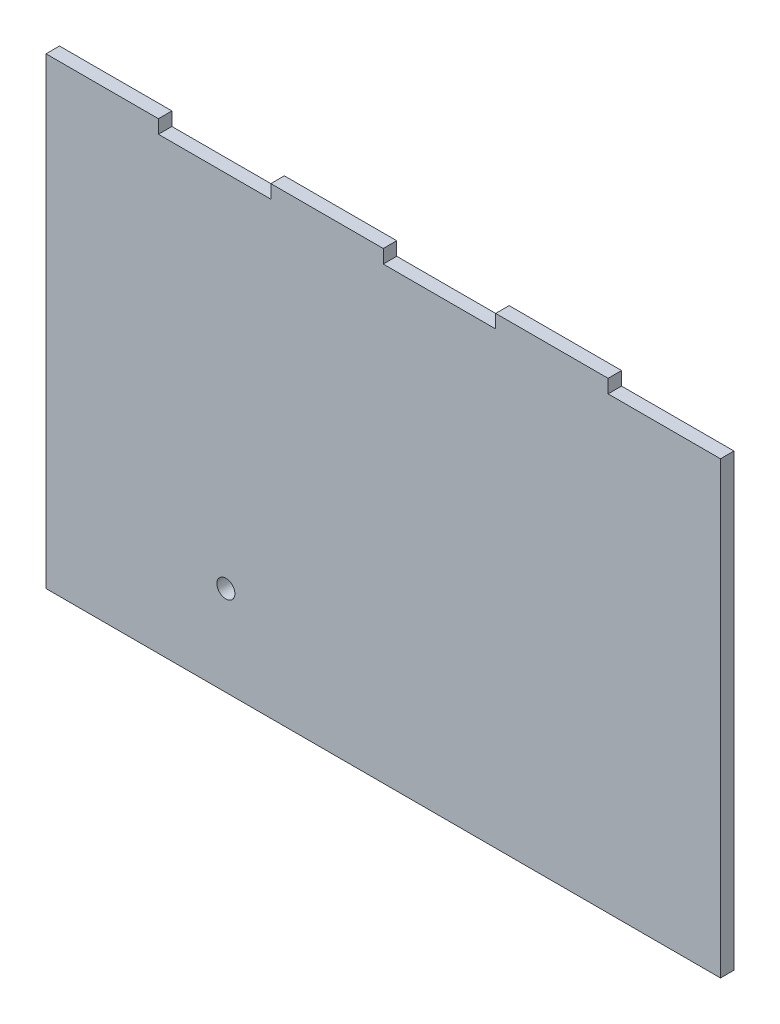
ISO-10303-21;
HEADER;
FILE_DESCRIPTION(('STEP AP214'),'2;1');
FILE_NAME('part.step','',(''),(''),'','','');
FILE_SCHEMA(('AUTOMOTIVE_DESIGN { 1 0 10303 214 1 1 1 1 }'));
ENDSEC;
DATA;
#1=APPLICATION_CONTEXT('core data for automotive mechanical design processes');
#2=APPLICATION_PROTOCOL_DEFINITION('international standard','automotive_design',2000,#1);
#3=PRODUCT_CONTEXT('',#1,'mechanical');
#4=PRODUCT('Part','Part','',(#3));
#5=PRODUCT_RELATED_PRODUCT_CATEGORY('part','',(#4));
#6=PRODUCT_DEFINITION_FORMATION('','',#4);
#7=PRODUCT_DEFINITION_CONTEXT('part definition',#1,'design');
#8=PRODUCT_DEFINITION('design','',#6,#7);
#9=PRODUCT_DEFINITION_SHAPE('','',#8);
#10=(LENGTH_UNIT() NAMED_UNIT(*) SI_UNIT(.MILLI.,.METRE.));
#11=(NAMED_UNIT(*) PLANE_ANGLE_UNIT() SI_UNIT($,.RADIAN.));
#12=(NAMED_UNIT(*) SI_UNIT($,.STERADIAN.) SOLID_ANGLE_UNIT());
#13=UNCERTAINTY_MEASURE_WITH_UNIT(LENGTH_MEASURE(1.E-05),#10,'distance_accuracy_value','');
#14=(GEOMETRIC_REPRESENTATION_CONTEXT(3) GLOBAL_UNCERTAINTY_ASSIGNED_CONTEXT((#13)) GLOBAL_UNIT_ASSIGNED_CONTEXT((#10,
#11,#12)) REPRESENTATION_CONTEXT('',''));
#15=CARTESIAN_POINT('',(0.,0.,0.));
#16=DIRECTION('',(0.,0.,1.));
#17=DIRECTION('',(1.,0.,0.));
#18=AXIS2_PLACEMENT_3D('',#15,#16,#17);
#19=CARTESIAN_POINT('',(0.,0.,6.));
#20=DIRECTION('',(0.,0.,-1.));
#21=DIRECTION('',(-1.,0.,0.));
#22=AXIS2_PLACEMENT_3D('',#19,#20,#21);
#23=PLANE('',#22);
#24=DIRECTION('',(0.,-1.,0.));
#25=VECTOR('',#24,1.);
#26=CARTESIAN_POINT('',(0.,0.,6.));
#27=LINE('',#26,#25);
#28=CARTESIAN_POINT('',(0.,206.,6.));
#29=VERTEX_POINT('',#28);
#30=CARTESIAN_POINT('',(0.,0.,6.));
#31=VERTEX_POINT('',#30);
#32=EDGE_CURVE('E51',#29,#31,#27,.T.);
#33=ORIENTED_EDGE('',*,*,#32,.T.);
#34=DIRECTION('',(1.,0.,0.));
#35=VECTOR('',#34,1.);
#36=CARTESIAN_POINT('',(0.,0.,6.));
#37=LINE('',#36,#35);
#38=CARTESIAN_POINT('',(300.,0.,6.));
#39=VERTEX_POINT('',#38);
#40=EDGE_CURVE('E113',#31,#39,#37,.T.);
#41=ORIENTED_EDGE('',*,*,#40,.T.);
#42=DIRECTION('',(0.,1.,0.));
#43=VECTOR('',#42,1.);
#44=CARTESIAN_POINT('',(300.,0.,6.));
#45=LINE('',#44,#43);
#46=CARTESIAN_POINT('',(300.,200.,6.));
#47=VERTEX_POINT('',#46);
#48=EDGE_CURVE('E229',#39,#47,#45,.T.);
#49=ORIENTED_EDGE('',*,*,#48,.T.);
#50=DIRECTION('',(-1.,0.,0.));
#51=VECTOR('',#50,1.);
#52=CARTESIAN_POINT('',(250.,200.,6.));
#53=LINE('',#52,#51);
#54=CARTESIAN_POINT('',(250.,200.,6.));
#55=VERTEX_POINT('',#54);
#56=EDGE_CURVE('E249',#47,#55,#53,.T.);
#57=ORIENTED_EDGE('',*,*,#56,.T.);
#58=DIRECTION('',(0.,1.,0.));
#59=VECTOR('',#58,1.);
#60=CARTESIAN_POINT('',(250.,206.,6.));
#61=LINE('',#60,#59);
#62=CARTESIAN_POINT('',(250.,206.,6.));
#63=VERTEX_POINT('',#62);
#64=EDGE_CURVE('E246',#55,#63,#61,.T.);
#65=ORIENTED_EDGE('',*,*,#64,.T.);
#66=DIRECTION('',(-1.,0.,0.));
#67=VECTOR('',#66,1.);
#68=CARTESIAN_POINT('',(200.,206.,6.));
#69=LINE('',#68,#67);
#70=CARTESIAN_POINT('',(200.,206.,6.));
#71=VERTEX_POINT('',#70);
#72=EDGE_CURVE('E248',#63,#71,#69,.T.);
#73=ORIENTED_EDGE('',*,*,#72,.T.);
#74=DIRECTION('',(0.,-1.,0.));
#75=VECTOR('',#74,1.);
#76=CARTESIAN_POINT('',(200.,200.,6.));
#77=LINE('',#76,#75);
#78=CARTESIAN_POINT('',(200.,200.,6.));
#79=VERTEX_POINT('',#78);
#80=EDGE_CURVE('E251',#71,#79,#77,.T.);
#81=ORIENTED_EDGE('',*,*,#80,.T.);
#82=DIRECTION('',(-1.,0.,0.));
#83=VECTOR('',#82,1.);
#84=CARTESIAN_POINT('',(150.,200.,6.));
#85=LINE('',#84,#83);
#86=CARTESIAN_POINT('',(150.,200.,6.));
#87=VERTEX_POINT('',#86);
#88=EDGE_CURVE('E257',#79,#87,#85,.T.);
#89=ORIENTED_EDGE('',*,*,#88,.T.);
#90=DIRECTION('',(0.,1.,0.));
#91=VECTOR('',#90,1.);
#92=CARTESIAN_POINT('',(150.,206.,6.));
#93=LINE('',#92,#91);
#94=CARTESIAN_POINT('',(150.,206.,6.));
#95=VERTEX_POINT('',#94);
#96=EDGE_CURVE('E259',#87,#95,#93,.T.);
#97=ORIENTED_EDGE('',*,*,#96,.T.);
#98=DIRECTION('',(-1.,0.,0.));
#99=VECTOR('',#98,1.);
#100=CARTESIAN_POINT('',(100.,206.,6.));
#101=LINE('',#100,#99);
#102=CARTESIAN_POINT('',(100.,206.,6.));
#103=VERTEX_POINT('',#102);
#104=EDGE_CURVE('E261',#95,#103,#101,.T.);
#105=ORIENTED_EDGE('',*,*,#104,.T.);
#106=DIRECTION('',(0.,-1.,0.));
#107=VECTOR('',#106,1.);
#108=CARTESIAN_POINT('',(100.,200.,6.));
#109=LINE('',#108,#107);
#110=CARTESIAN_POINT('',(100.,200.,6.));
#111=VERTEX_POINT('',#110);
#112=EDGE_CURVE('E151',#103,#111,#109,.T.);
#113=ORIENTED_EDGE('',*,*,#112,.T.);
#114=DIRECTION('',(-1.,0.,0.));
#115=VECTOR('',#114,1.);
#116=CARTESIAN_POINT('',(50.,200.,6.));
#117=LINE('',#116,#115);
#118=CARTESIAN_POINT('',(50.,200.,6.));
#119=VERTEX_POINT('',#118);
#120=EDGE_CURVE('E145',#111,#119,#117,.T.);
#121=ORIENTED_EDGE('',*,*,#120,.T.);
#122=DIRECTION('',(0.,1.,0.));
#123=VECTOR('',#122,1.);
#124=CARTESIAN_POINT('',(50.,206.,6.));
#125=LINE('',#124,#123);
#126=CARTESIAN_POINT('',(50.,206.,6.));
#127=VERTEX_POINT('',#126);
#128=EDGE_CURVE('E149',#119,#127,#125,.T.);
#129=ORIENTED_EDGE('',*,*,#128,.T.);
#130=DIRECTION('',(-1.,0.,0.));
#131=VECTOR('',#130,1.);
#132=CARTESIAN_POINT('',(0.,206.,6.));
#133=LINE('',#132,#131);
#134=EDGE_CURVE('E165',#127,#29,#133,.T.);
#135=ORIENTED_EDGE('',*,*,#134,.T.);
#136=EDGE_LOOP('',(#33,#41,#49,#57,#65,#73,#81,#89,#97,#105,#113,#121,#129,#135));
#137=FACE_BOUND('',#136,.T.);
#138=CARTESIAN_POINT('',(80.,40.,6.));
#139=DIRECTION('',(0.,0.,1.));
#140=DIRECTION('',(1.,0.,0.));
#141=AXIS2_PLACEMENT_3D('',#138,#139,#140);
#142=CIRCLE('',#141,4.00000000000001);
#143=CARTESIAN_POINT('',(84.,40.,6.));
#144=VERTEX_POINT('',#143);
#145=EDGE_CURVE('E174',#144,#144,#142,.T.);
#146=ORIENTED_EDGE('',*,*,#145,.F.);
#147=EDGE_LOOP('',(#146));
#148=FACE_BOUND('',#147,.T.);
#149=ADVANCED_FACE('F34',(#137,#148),#23,.F.);
#150=CARTESIAN_POINT('',(0.,0.,0.));
#151=DIRECTION('',(0.,0.,-1.));
#152=DIRECTION('',(-1.,0.,0.));
#153=AXIS2_PLACEMENT_3D('',#150,#151,#152);
#154=PLANE('',#153);
#155=DIRECTION('',(1.,0.,0.));
#156=VECTOR('',#155,1.);
#157=CARTESIAN_POINT('',(0.,0.,0.));
#158=LINE('',#157,#156);
#159=CARTESIAN_POINT('',(0.,0.,0.));
#160=VERTEX_POINT('',#159);
#161=CARTESIAN_POINT('',(300.,0.,0.));
#162=VERTEX_POINT('',#161);
#163=EDGE_CURVE('E171',#160,#162,#158,.T.);
#164=ORIENTED_EDGE('',*,*,#163,.F.);
#165=DIRECTION('',(0.,-1.,0.));
#166=VECTOR('',#165,1.);
#167=CARTESIAN_POINT('',(0.,200.,0.));
#168=LINE('',#167,#166);
#169=CARTESIAN_POINT('',(0.,206.,0.));
#170=VERTEX_POINT('',#169);
#171=EDGE_CURVE('E195',#170,#160,#168,.T.);
#172=ORIENTED_EDGE('',*,*,#171,.F.);
#173=DIRECTION('',(-1.,0.,0.));
#174=VECTOR('',#173,1.);
#175=CARTESIAN_POINT('',(0.,206.,0.));
#176=LINE('',#175,#174);
#177=CARTESIAN_POINT('',(50.,206.,0.));
#178=VERTEX_POINT('',#177);
#179=EDGE_CURVE('E106',#178,#170,#176,.T.);
#180=ORIENTED_EDGE('',*,*,#179,.F.);
#181=DIRECTION('',(0.,1.,0.));
#182=VECTOR('',#181,1.);
#183=CARTESIAN_POINT('',(50.,206.,0.));
#184=LINE('',#183,#182);
#185=CARTESIAN_POINT('',(50.,200.,0.));
#186=VERTEX_POINT('',#185);
#187=EDGE_CURVE('E99',#186,#178,#184,.T.);
#188=ORIENTED_EDGE('',*,*,#187,.F.);
#189=DIRECTION('',(-1.,0.,0.));
#190=VECTOR('',#189,1.);
#191=CARTESIAN_POINT('',(50.,200.,0.));
#192=LINE('',#191,#190);
#193=CARTESIAN_POINT('',(100.,200.,0.));
#194=VERTEX_POINT('',#193);
#195=EDGE_CURVE('E159',#194,#186,#192,.T.);
#196=ORIENTED_EDGE('',*,*,#195,.F.);
#197=DIRECTION('',(0.,-1.,0.));
#198=VECTOR('',#197,1.);
#199=CARTESIAN_POINT('',(100.,200.,0.));
#200=LINE('',#199,#198);
#201=CARTESIAN_POINT('',(100.,206.,0.));
#202=VERTEX_POINT('',#201);
#203=EDGE_CURVE('E190',#202,#194,#200,.T.);
#204=ORIENTED_EDGE('',*,*,#203,.F.);
#205=DIRECTION('',(-1.,0.,0.));
#206=VECTOR('',#205,1.);
#207=CARTESIAN_POINT('',(100.,206.,0.));
#208=LINE('',#207,#206);
#209=CARTESIAN_POINT('',(150.,206.,0.));
#210=VERTEX_POINT('',#209);
#211=EDGE_CURVE('E188',#210,#202,#208,.T.);
#212=ORIENTED_EDGE('',*,*,#211,.F.);
#213=DIRECTION('',(0.,1.,0.));
#214=VECTOR('',#213,1.);
#215=CARTESIAN_POINT('',(150.,206.,0.));
#216=LINE('',#215,#214);
#217=CARTESIAN_POINT('',(150.,200.,0.));
#218=VERTEX_POINT('',#217);
#219=EDGE_CURVE('E186',#218,#210,#216,.T.);
#220=ORIENTED_EDGE('',*,*,#219,.F.);
#221=DIRECTION('',(-1.,0.,0.));
#222=VECTOR('',#221,1.);
#223=CARTESIAN_POINT('',(150.,200.,0.));
#224=LINE('',#223,#222);
#225=CARTESIAN_POINT('',(200.,200.,0.));
#226=VERTEX_POINT('',#225);
#227=EDGE_CURVE('E184',#226,#218,#224,.T.);
#228=ORIENTED_EDGE('',*,*,#227,.F.);
#229=DIRECTION('',(0.,-1.,0.));
#230=VECTOR('',#229,1.);
#231=CARTESIAN_POINT('',(200.,200.,0.));
#232=LINE('',#231,#230);
#233=CARTESIAN_POINT('',(200.,206.,0.));
#234=VERTEX_POINT('',#233);
#235=EDGE_CURVE('E182',#234,#226,#232,.T.);
#236=ORIENTED_EDGE('',*,*,#235,.F.);
#237=DIRECTION('',(-1.,0.,0.));
#238=VECTOR('',#237,1.);
#239=CARTESIAN_POINT('',(200.,206.,0.));
#240=LINE('',#239,#238);
#241=CARTESIAN_POINT('',(250.,206.,0.));
#242=VERTEX_POINT('',#241);
#243=EDGE_CURVE('E180',#242,#234,#240,.T.);
#244=ORIENTED_EDGE('',*,*,#243,.F.);
#245=DIRECTION('',(0.,1.,0.));
#246=VECTOR('',#245,1.);
#247=CARTESIAN_POINT('',(250.,206.,0.));
#248=LINE('',#247,#246);
#249=CARTESIAN_POINT('',(250.,200.,0.));
#250=VERTEX_POINT('',#249);
#251=EDGE_CURVE('E178',#250,#242,#248,.T.);
#252=ORIENTED_EDGE('',*,*,#251,.F.);
#253=DIRECTION('',(-1.,0.,0.));
#254=VECTOR('',#253,1.);
#255=CARTESIAN_POINT('',(250.,200.,0.));
#256=LINE('',#255,#254);
#257=CARTESIAN_POINT('',(300.,200.,0.));
#258=VERTEX_POINT('',#257);
#259=EDGE_CURVE('E176',#258,#250,#256,.T.);
#260=ORIENTED_EDGE('',*,*,#259,.F.);
#261=DIRECTION('',(0.,1.,0.));
#262=VECTOR('',#261,1.);
#263=CARTESIAN_POINT('',(300.,0.,0.));
#264=LINE('',#263,#262);
#265=EDGE_CURVE('E173',#162,#258,#264,.T.);
#266=ORIENTED_EDGE('',*,*,#265,.F.);
#267=EDGE_LOOP('',(#164,#172,#180,#188,#196,#204,#212,#220,#228,#236,#244,#252,#260,#266));
#268=FACE_BOUND('',#267,.T.);
#269=CARTESIAN_POINT('',(80.,40.,0.));
#270=DIRECTION('',(0.,0.,1.));
#271=DIRECTION('',(1.,0.,0.));
#272=AXIS2_PLACEMENT_3D('',#269,#270,#271);
#273=CIRCLE('',#272,4.00000000000001);
#274=CARTESIAN_POINT('',(84.,40.,0.));
#275=VERTEX_POINT('',#274);
#276=EDGE_CURVE('E277',#275,#275,#273,.T.);
#277=ORIENTED_EDGE('',*,*,#276,.T.);
#278=EDGE_LOOP('',(#277));
#279=FACE_BOUND('',#278,.T.);
#280=ADVANCED_FACE('F233',(#268,#279),#154,.T.);
#281=CARTESIAN_POINT('',(0.,0.,6.));
#282=DIRECTION('',(0.,1.,0.));
#283=DIRECTION('',(0.,0.,1.));
#284=AXIS2_PLACEMENT_3D('',#281,#282,#283);
#285=PLANE('',#284);
#286=ORIENTED_EDGE('',*,*,#163,.T.);
#287=DIRECTION('',(0.,0.,-1.));
#288=VECTOR('',#287,1.);
#289=CARTESIAN_POINT('',(300.,0.,6.));
#290=LINE('',#289,#288);
#291=EDGE_CURVE('E43',#39,#162,#290,.T.);
#292=ORIENTED_EDGE('',*,*,#291,.F.);
#293=ORIENTED_EDGE('',*,*,#40,.F.);
#294=DIRECTION('',(0.,0.,-1.));
#295=VECTOR('',#294,1.);
#296=CARTESIAN_POINT('',(0.,0.,6.));
#297=LINE('',#296,#295);
#298=EDGE_CURVE('E11',#31,#160,#297,.T.);
#299=ORIENTED_EDGE('',*,*,#298,.T.);
#300=EDGE_LOOP('',(#286,#292,#293,#299));
#301=FACE_BOUND('',#300,.T.);
#302=ADVANCED_FACE('F36',(#301),#285,.F.);
#303=CARTESIAN_POINT('',(300.,0.,6.));
#304=DIRECTION('',(-1.,0.,0.));
#305=DIRECTION('',(0.,0.,1.));
#306=AXIS2_PLACEMENT_3D('',#303,#304,#305);
#307=PLANE('',#306);
#308=ORIENTED_EDGE('',*,*,#265,.T.);
#309=DIRECTION('',(0.,0.,-1.));
#310=VECTOR('',#309,1.);
#311=CARTESIAN_POINT('',(300.,200.,6.));
#312=LINE('',#311,#310);
#313=EDGE_CURVE('E221',#47,#258,#312,.T.);
#314=ORIENTED_EDGE('',*,*,#313,.F.);
#315=ORIENTED_EDGE('',*,*,#48,.F.);
#316=ORIENTED_EDGE('',*,*,#291,.T.);
#317=EDGE_LOOP('',(#308,#314,#315,#316));
#318=FACE_BOUND('',#317,.T.);
#319=ADVANCED_FACE('F227',(#318),#307,.F.);
#320=CARTESIAN_POINT('',(250.,200.,6.));
#321=DIRECTION('',(0.,-1.,0.));
#322=DIRECTION('',(0.,0.,-1.));
#323=AXIS2_PLACEMENT_3D('',#320,#321,#322);
#324=PLANE('',#323);
#325=ORIENTED_EDGE('',*,*,#259,.T.);
#326=DIRECTION('',(0.,0.,-1.));
#327=VECTOR('',#326,1.);
#328=CARTESIAN_POINT('',(250.,200.,6.));
#329=LINE('',#328,#327);
#330=EDGE_CURVE('E218',#55,#250,#329,.T.);
#331=ORIENTED_EDGE('',*,*,#330,.F.);
#332=ORIENTED_EDGE('',*,*,#56,.F.);
#333=ORIENTED_EDGE('',*,*,#313,.T.);
#334=EDGE_LOOP('',(#325,#331,#332,#333));
#335=FACE_BOUND('',#334,.T.);
#336=ADVANCED_FACE('F240',(#335),#324,.F.);
#337=CARTESIAN_POINT('',(250.,206.,6.));
#338=DIRECTION('',(-1.,0.,0.));
#339=DIRECTION('',(0.,0.,1.));
#340=AXIS2_PLACEMENT_3D('',#337,#338,#339);
#341=PLANE('',#340);
#342=ORIENTED_EDGE('',*,*,#251,.T.);
#343=DIRECTION('',(0.,0.,-1.));
#344=VECTOR('',#343,1.);
#345=CARTESIAN_POINT('',(250.,206.,6.));
#346=LINE('',#345,#344);
#347=EDGE_CURVE('E215',#63,#242,#346,.T.);
#348=ORIENTED_EDGE('',*,*,#347,.F.);
#349=ORIENTED_EDGE('',*,*,#64,.F.);
#350=ORIENTED_EDGE('',*,*,#330,.T.);
#351=EDGE_LOOP('',(#342,#348,#349,#350));
#352=FACE_BOUND('',#351,.T.);
#353=ADVANCED_FACE('F244',(#352),#341,.F.);
#354=CARTESIAN_POINT('',(200.,206.,6.));
#355=DIRECTION('',(0.,-1.,0.));
#356=DIRECTION('',(0.,0.,-1.));
#357=AXIS2_PLACEMENT_3D('',#354,#355,#356);
#358=PLANE('',#357);
#359=ORIENTED_EDGE('',*,*,#243,.T.);
#360=DIRECTION('',(0.,0.,-1.));
#361=VECTOR('',#360,1.);
#362=CARTESIAN_POINT('',(200.,206.,6.));
#363=LINE('',#362,#361);
#364=EDGE_CURVE('E212',#71,#234,#363,.T.);
#365=ORIENTED_EDGE('',*,*,#364,.F.);
#366=ORIENTED_EDGE('',*,*,#72,.F.);
#367=ORIENTED_EDGE('',*,*,#347,.T.);
#368=EDGE_LOOP('',(#359,#365,#366,#367));
#369=FACE_BOUND('',#368,.T.);
#370=ADVANCED_FACE('F316',(#369),#358,.F.);
#371=CARTESIAN_POINT('',(200.,200.,6.));
#372=DIRECTION('',(1.,0.,0.));
#373=DIRECTION('',(0.,0.,-1.));
#374=AXIS2_PLACEMENT_3D('',#371,#372,#373);
#375=PLANE('',#374);
#376=ORIENTED_EDGE('',*,*,#235,.T.);
#377=DIRECTION('',(0.,0.,-1.));
#378=VECTOR('',#377,1.);
#379=CARTESIAN_POINT('',(200.,200.,6.));
#380=LINE('',#379,#378);
#381=EDGE_CURVE('E209',#79,#226,#380,.T.);
#382=ORIENTED_EDGE('',*,*,#381,.F.);
#383=ORIENTED_EDGE('',*,*,#80,.F.);
#384=ORIENTED_EDGE('',*,*,#364,.T.);
#385=EDGE_LOOP('',(#376,#382,#383,#384));
#386=FACE_BOUND('',#385,.T.);
#387=ADVANCED_FACE('F312',(#386),#375,.F.);
#388=CARTESIAN_POINT('',(150.,200.,6.));
#389=DIRECTION('',(0.,-1.,0.));
#390=DIRECTION('',(0.,0.,-1.));
#391=AXIS2_PLACEMENT_3D('',#388,#389,#390);
#392=PLANE('',#391);
#393=ORIENTED_EDGE('',*,*,#227,.T.);
#394=DIRECTION('',(0.,0.,-1.));
#395=VECTOR('',#394,1.);
#396=CARTESIAN_POINT('',(150.,200.,6.));
#397=LINE('',#396,#395);
#398=EDGE_CURVE('E206',#87,#218,#397,.T.);
#399=ORIENTED_EDGE('',*,*,#398,.F.);
#400=ORIENTED_EDGE('',*,*,#88,.F.);
#401=ORIENTED_EDGE('',*,*,#381,.T.);
#402=EDGE_LOOP('',(#393,#399,#400,#401));
#403=FACE_BOUND('',#402,.T.);
#404=ADVANCED_FACE('F308',(#403),#392,.F.);
#405=CARTESIAN_POINT('',(150.,206.,6.));
#406=DIRECTION('',(-1.,0.,0.));
#407=DIRECTION('',(0.,0.,1.));
#408=AXIS2_PLACEMENT_3D('',#405,#406,#407);
#409=PLANE('',#408);
#410=ORIENTED_EDGE('',*,*,#219,.T.);
#411=DIRECTION('',(0.,0.,-1.));
#412=VECTOR('',#411,1.);
#413=CARTESIAN_POINT('',(150.,206.,6.));
#414=LINE('',#413,#412);
#415=EDGE_CURVE('E203',#95,#210,#414,.T.);
#416=ORIENTED_EDGE('',*,*,#415,.F.);
#417=ORIENTED_EDGE('',*,*,#96,.F.);
#418=ORIENTED_EDGE('',*,*,#398,.T.);
#419=EDGE_LOOP('',(#410,#416,#417,#418));
#420=FACE_BOUND('',#419,.T.);
#421=ADVANCED_FACE('F305',(#420),#409,.F.);
#422=CARTESIAN_POINT('',(100.,206.,6.));
#423=DIRECTION('',(0.,-1.,0.));
#424=DIRECTION('',(0.,0.,-1.));
#425=AXIS2_PLACEMENT_3D('',#422,#423,#424);
#426=PLANE('',#425);
#427=ORIENTED_EDGE('',*,*,#211,.T.);
#428=DIRECTION('',(0.,0.,-1.));
#429=VECTOR('',#428,1.);
#430=CARTESIAN_POINT('',(100.,206.,6.));
#431=LINE('',#430,#429);
#432=EDGE_CURVE('E200',#103,#202,#431,.T.);
#433=ORIENTED_EDGE('',*,*,#432,.F.);
#434=ORIENTED_EDGE('',*,*,#104,.F.);
#435=ORIENTED_EDGE('',*,*,#415,.T.);
#436=EDGE_LOOP('',(#427,#433,#434,#435));
#437=FACE_BOUND('',#436,.T.);
#438=ADVANCED_FACE('F267',(#437),#426,.F.);
#439=CARTESIAN_POINT('',(100.,200.,6.));
#440=DIRECTION('',(1.,0.,0.));
#441=DIRECTION('',(0.,0.,-1.));
#442=AXIS2_PLACEMENT_3D('',#439,#440,#441);
#443=PLANE('',#442);
#444=ORIENTED_EDGE('',*,*,#203,.T.);
#445=DIRECTION('',(0.,0.,-1.));
#446=VECTOR('',#445,1.);
#447=CARTESIAN_POINT('',(100.,200.,6.));
#448=LINE('',#447,#446);
#449=EDGE_CURVE('E160',#111,#194,#448,.T.);
#450=ORIENTED_EDGE('',*,*,#449,.F.);
#451=ORIENTED_EDGE('',*,*,#112,.F.);
#452=ORIENTED_EDGE('',*,*,#432,.T.);
#453=EDGE_LOOP('',(#444,#450,#451,#452));
#454=FACE_BOUND('',#453,.T.);
#455=ADVANCED_FACE('F271',(#454),#443,.F.);
#456=CARTESIAN_POINT('',(50.,200.,6.));
#457=DIRECTION('',(0.,-1.,0.));
#458=DIRECTION('',(0.,0.,-1.));
#459=AXIS2_PLACEMENT_3D('',#456,#457,#458);
#460=PLANE('',#459);
#461=ORIENTED_EDGE('',*,*,#195,.T.);
#462=DIRECTION('',(0.,0.,-1.));
#463=VECTOR('',#462,1.);
#464=CARTESIAN_POINT('',(50.,200.,6.));
#465=LINE('',#464,#463);
#466=EDGE_CURVE('E156',#119,#186,#465,.T.);
#467=ORIENTED_EDGE('',*,*,#466,.F.);
#468=ORIENTED_EDGE('',*,*,#120,.F.);
#469=ORIENTED_EDGE('',*,*,#449,.T.);
#470=EDGE_LOOP('',(#461,#467,#468,#469));
#471=FACE_BOUND('',#470,.T.);
#472=ADVANCED_FACE('F157',(#471),#460,.F.);
#473=CARTESIAN_POINT('',(50.,206.,6.));
#474=DIRECTION('',(-1.,0.,0.));
#475=DIRECTION('',(0.,0.,1.));
#476=AXIS2_PLACEMENT_3D('',#473,#474,#475);
#477=PLANE('',#476);
#478=ORIENTED_EDGE('',*,*,#187,.T.);
#479=DIRECTION('',(0.,0.,-1.));
#480=VECTOR('',#479,1.);
#481=CARTESIAN_POINT('',(50.,206.,6.));
#482=LINE('',#481,#480);
#483=EDGE_CURVE('E161',#127,#178,#482,.T.);
#484=ORIENTED_EDGE('',*,*,#483,.F.);
#485=ORIENTED_EDGE('',*,*,#128,.F.);
#486=ORIENTED_EDGE('',*,*,#466,.T.);
#487=EDGE_LOOP('',(#478,#484,#485,#486));
#488=FACE_BOUND('',#487,.T.);
#489=ADVANCED_FACE('F163',(#488),#477,.F.);
#490=CARTESIAN_POINT('',(0.,206.,6.));
#491=DIRECTION('',(0.,-1.,0.));
#492=DIRECTION('',(0.,0.,-1.));
#493=AXIS2_PLACEMENT_3D('',#490,#491,#492);
#494=PLANE('',#493);
#495=ORIENTED_EDGE('',*,*,#179,.T.);
#496=DIRECTION('',(0.,0.,-1.));
#497=VECTOR('',#496,1.);
#498=CARTESIAN_POINT('',(0.,206.,6.));
#499=LINE('',#498,#497);
#500=EDGE_CURVE('E167',#29,#170,#499,.T.);
#501=ORIENTED_EDGE('',*,*,#500,.F.);
#502=ORIENTED_EDGE('',*,*,#134,.F.);
#503=ORIENTED_EDGE('',*,*,#483,.T.);
#504=EDGE_LOOP('',(#495,#501,#502,#503));
#505=FACE_BOUND('',#504,.T.);
#506=ADVANCED_FACE('F273',(#505),#494,.F.);
#507=CARTESIAN_POINT('',(0.,200.,6.));
#508=DIRECTION('',(1.,0.,0.));
#509=DIRECTION('',(0.,0.,-1.));
#510=AXIS2_PLACEMENT_3D('',#507,#508,#509);
#511=PLANE('',#510);
#512=ORIENTED_EDGE('',*,*,#171,.T.);
#513=ORIENTED_EDGE('',*,*,#298,.F.);
#514=ORIENTED_EDGE('',*,*,#32,.F.);
#515=ORIENTED_EDGE('',*,*,#500,.T.);
#516=EDGE_LOOP('',(#512,#513,#514,#515));
#517=FACE_BOUND('',#516,.T.);
#518=ADVANCED_FACE('F272',(#517),#511,.F.);
#519=CARTESIAN_POINT('',(80.,40.,6.));
#520=DIRECTION('',(0.,0.,-1.));
#521=DIRECTION('',(-1.,0.,0.));
#522=AXIS2_PLACEMENT_3D('',#519,#520,#521);
#523=CYLINDRICAL_SURFACE('',#522,4.00000000000001);
#524=ORIENTED_EDGE('',*,*,#145,.T.);
#525=EDGE_LOOP('',(#524));
#526=FACE_BOUND('',#525,.T.);
#527=ORIENTED_EDGE('',*,*,#276,.F.);
#528=EDGE_LOOP('',(#527));
#529=FACE_BOUND('',#528,.T.);
#530=ADVANCED_FACE('F283',(#526,#529),#523,.F.);
#531=CLOSED_SHELL('',(#149,#280,#302,#319,#336,#353,#370,#387,#404,#421,#438,#455,#472,#489,
#506,#518,#530));
#532=MANIFOLD_SOLID_BREP('B2',#531);
#533=ADVANCED_BREP_SHAPE_REPRESENTATION('',(#18,#532),#14);
#534=SHAPE_DEFINITION_REPRESENTATION(#9,#533);
ENDSEC;
END-ISO-10303-21;
